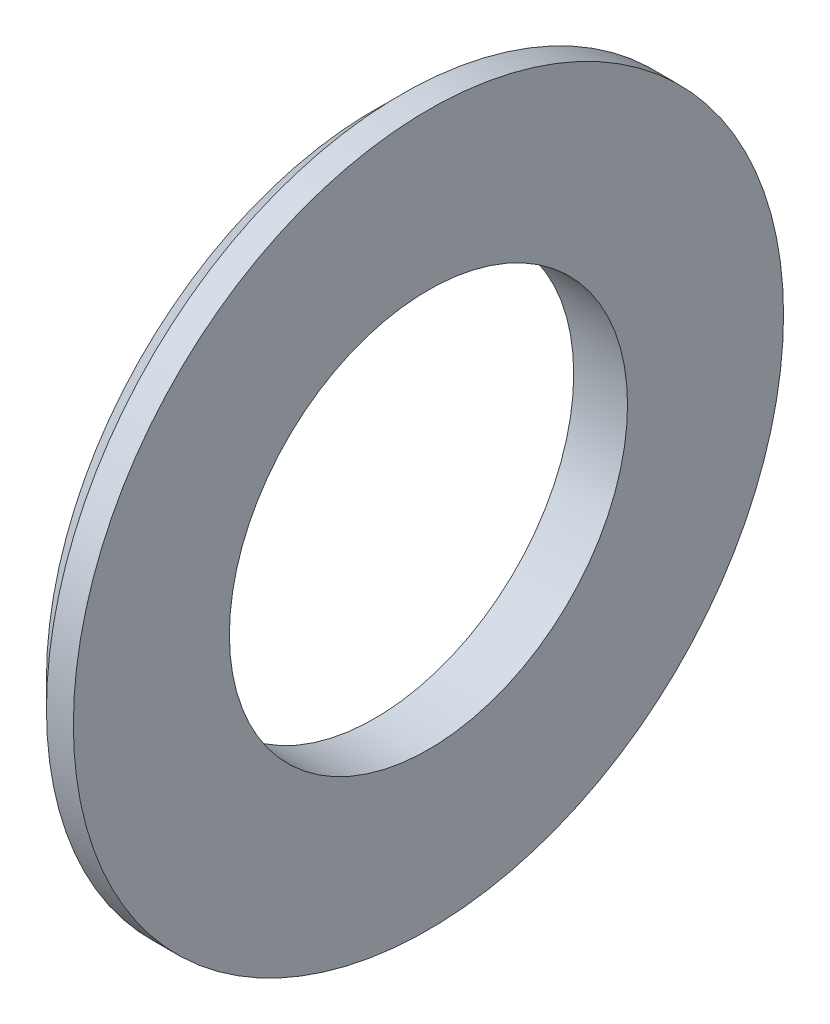
ISO-10303-21;
HEADER;
FILE_DESCRIPTION(('STEP AP214'),'2;1');
FILE_NAME('part.step','',(''),(''),'','','');
FILE_SCHEMA(('AUTOMOTIVE_DESIGN { 1 0 10303 214 1 1 1 1 }'));
ENDSEC;
DATA;
#1=APPLICATION_CONTEXT('core data for automotive mechanical design processes');
#2=APPLICATION_PROTOCOL_DEFINITION('international standard','automotive_design',2000,#1);
#3=PRODUCT_CONTEXT('',#1,'mechanical');
#4=PRODUCT('Part','Part','',(#3));
#5=PRODUCT_RELATED_PRODUCT_CATEGORY('part','',(#4));
#6=PRODUCT_DEFINITION_FORMATION('','',#4);
#7=PRODUCT_DEFINITION_CONTEXT('part definition',#1,'design');
#8=PRODUCT_DEFINITION('design','',#6,#7);
#9=PRODUCT_DEFINITION_SHAPE('','',#8);
#10=(LENGTH_UNIT() NAMED_UNIT(*) SI_UNIT(.MILLI.,.METRE.));
#11=(NAMED_UNIT(*) PLANE_ANGLE_UNIT() SI_UNIT($,.RADIAN.));
#12=(NAMED_UNIT(*) SI_UNIT($,.STERADIAN.) SOLID_ANGLE_UNIT());
#13=UNCERTAINTY_MEASURE_WITH_UNIT(LENGTH_MEASURE(1.E-05),#10,'distance_accuracy_value','');
#14=(GEOMETRIC_REPRESENTATION_CONTEXT(3) GLOBAL_UNCERTAINTY_ASSIGNED_CONTEXT((#13)) GLOBAL_UNIT_ASSIGNED_CONTEXT((#10,
#11,#12)) REPRESENTATION_CONTEXT('',''));
#15=CARTESIAN_POINT('',(0.,0.,0.));
#16=DIRECTION('',(0.,0.,1.));
#17=DIRECTION('',(1.,0.,0.));
#18=AXIS2_PLACEMENT_3D('',#15,#16,#17);
#19=CARTESIAN_POINT('',(-34.9249999999999,0.,0.));
#20=DIRECTION('',(-1.,0.,0.));
#21=DIRECTION('',(0.,0.,1.));
#22=AXIS2_PLACEMENT_3D('',#19,#20,#21);
#23=CYLINDRICAL_SURFACE('',#22,18.5);
#24=CARTESIAN_POINT('',(0.,0.,0.));
#25=DIRECTION('',(-1.,0.,0.));
#26=DIRECTION('',(0.,0.,1.));
#27=AXIS2_PLACEMENT_3D('',#24,#25,#26);
#28=CIRCLE('',#27,18.5);
#29=CARTESIAN_POINT('',(0.,0.,18.5));
#30=VERTEX_POINT('',#29);
#31=EDGE_CURVE('E10',#30,#30,#28,.T.);
#32=ORIENTED_EDGE('',*,*,#31,.F.);
#33=EDGE_LOOP('',(#32));
#34=FACE_BOUND('',#33,.T.);
#35=CARTESIAN_POINT('',(-5.,0.,0.));
#36=DIRECTION('',(-1.,0.,0.));
#37=DIRECTION('',(0.,0.,1.));
#38=AXIS2_PLACEMENT_3D('',#35,#36,#37);
#39=CIRCLE('',#38,18.5);
#40=CARTESIAN_POINT('',(-5.,0.,18.5));
#41=VERTEX_POINT('',#40);
#42=EDGE_CURVE('E49',#41,#41,#39,.T.);
#43=ORIENTED_EDGE('',*,*,#42,.T.);
#44=EDGE_LOOP('',(#43));
#45=FACE_BOUND('',#44,.T.);
#46=ADVANCED_FACE('F30',(#34,#45),#23,.F.);
#47=CARTESIAN_POINT('',(0.,18.5,0.));
#48=DIRECTION('',(-1.,0.,0.));
#49=DIRECTION('',(0.,0.,1.));
#50=AXIS2_PLACEMENT_3D('',#47,#48,#49);
#51=PLANE('',#50);
#52=CARTESIAN_POINT('',(0.,0.,0.));
#53=DIRECTION('',(-1.,0.,0.));
#54=DIRECTION('',(0.,0.,1.));
#55=AXIS2_PLACEMENT_3D('',#52,#53,#54);
#56=CIRCLE('',#55,33.);
#57=CARTESIAN_POINT('',(0.,0.,33.));
#58=VERTEX_POINT('',#57);
#59=EDGE_CURVE('E36',#58,#58,#56,.T.);
#60=ORIENTED_EDGE('',*,*,#59,.F.);
#61=EDGE_LOOP('',(#60));
#62=FACE_BOUND('',#61,.T.);
#63=ORIENTED_EDGE('',*,*,#31,.T.);
#64=EDGE_LOOP('',(#63));
#65=FACE_BOUND('',#64,.T.);
#66=ADVANCED_FACE('F68',(#62,#65),#51,.F.);
#67=CARTESIAN_POINT('',(-34.9249999999999,0.,0.));
#68=DIRECTION('',(-1.,0.,0.));
#69=DIRECTION('',(0.,0.,1.));
#70=AXIS2_PLACEMENT_3D('',#67,#68,#69);
#71=CYLINDRICAL_SURFACE('',#70,33.);
#72=CARTESIAN_POINT('',(-2.5,0.,0.));
#73=DIRECTION('',(-1.,0.,0.));
#74=DIRECTION('',(0.,0.,1.));
#75=AXIS2_PLACEMENT_3D('',#72,#73,#74);
#76=CIRCLE('',#75,33.);
#77=CARTESIAN_POINT('',(-2.5,0.,33.));
#78=VERTEX_POINT('',#77);
#79=EDGE_CURVE('E40',#78,#78,#76,.T.);
#80=ORIENTED_EDGE('',*,*,#79,.F.);
#81=EDGE_LOOP('',(#80));
#82=FACE_BOUND('',#81,.T.);
#83=ORIENTED_EDGE('',*,*,#59,.T.);
#84=EDGE_LOOP('',(#83));
#85=FACE_BOUND('',#84,.T.);
#86=ADVANCED_FACE('F62',(#82,#85),#71,.T.);
#87=CARTESIAN_POINT('',(-5.,0.,0.));
#88=DIRECTION('',(1.,0.,0.));
#89=DIRECTION('',(0.,0.,-1.));
#90=AXIS2_PLACEMENT_3D('',#87,#88,#89);
#91=CONICAL_SURFACE('',#90,30.5,0.785398163397455);
#92=ORIENTED_EDGE('',*,*,#79,.T.);
#93=EDGE_LOOP('',(#92));
#94=FACE_BOUND('',#93,.T.);
#95=CARTESIAN_POINT('',(-5.,0.,0.));
#96=DIRECTION('',(-1.,0.,0.));
#97=DIRECTION('',(0.,0.,1.));
#98=AXIS2_PLACEMENT_3D('',#95,#96,#97);
#99=CIRCLE('',#98,30.5);
#100=CARTESIAN_POINT('',(-5.,0.,30.5));
#101=VERTEX_POINT('',#100);
#102=EDGE_CURVE('E44',#101,#101,#99,.T.);
#103=ORIENTED_EDGE('',*,*,#102,.F.);
#104=EDGE_LOOP('',(#103));
#105=FACE_BOUND('',#104,.T.);
#106=ADVANCED_FACE('F57',(#94,#105),#91,.T.);
#107=CARTESIAN_POINT('',(-5.,30.5,0.));
#108=DIRECTION('',(1.,0.,0.));
#109=DIRECTION('',(0.,0.,-1.));
#110=AXIS2_PLACEMENT_3D('',#107,#108,#109);
#111=PLANE('',#110);
#112=ORIENTED_EDGE('',*,*,#42,.F.);
#113=EDGE_LOOP('',(#112));
#114=FACE_BOUND('',#113,.T.);
#115=ORIENTED_EDGE('',*,*,#102,.T.);
#116=EDGE_LOOP('',(#115));
#117=FACE_BOUND('',#116,.T.);
#118=ADVANCED_FACE('F54',(#114,#117),#111,.F.);
#119=CLOSED_SHELL('',(#46,#66,#86,#106,#118));
#120=MANIFOLD_SOLID_BREP('B2',#119);
#121=ADVANCED_BREP_SHAPE_REPRESENTATION('',(#18,#120),#14);
#122=SHAPE_DEFINITION_REPRESENTATION(#9,#121);
ENDSEC;
END-ISO-10303-21;
